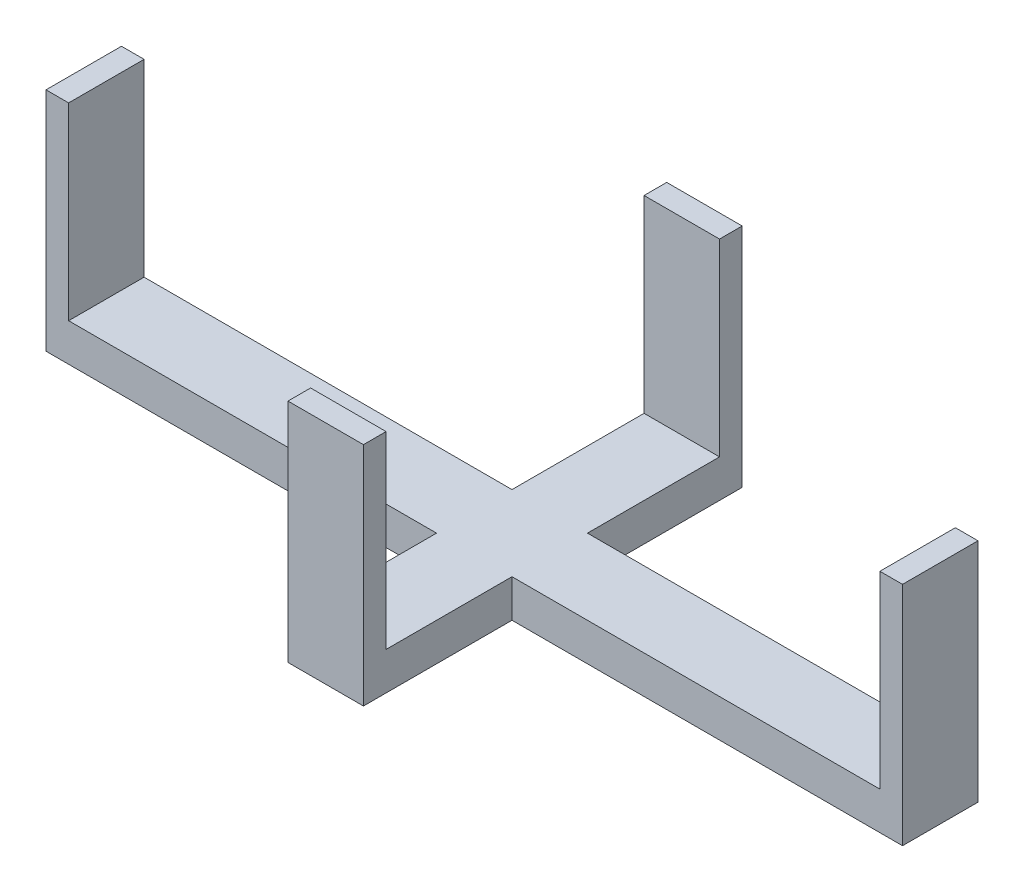
ISO-10303-21;
HEADER;
FILE_DESCRIPTION(('STEP AP214'),'2;1');
FILE_NAME('part.step','',(''),(''),'','','');
FILE_SCHEMA(('AUTOMOTIVE_DESIGN { 1 0 10303 214 1 1 1 1 }'));
ENDSEC;
DATA;
#1=APPLICATION_CONTEXT('core data for automotive mechanical design processes');
#2=APPLICATION_PROTOCOL_DEFINITION('international standard','automotive_design',2000,#1);
#3=PRODUCT_CONTEXT('',#1,'mechanical');
#4=PRODUCT('Part','Part','',(#3));
#5=PRODUCT_RELATED_PRODUCT_CATEGORY('part','',(#4));
#6=PRODUCT_DEFINITION_FORMATION('','',#4);
#7=PRODUCT_DEFINITION_CONTEXT('part definition',#1,'design');
#8=PRODUCT_DEFINITION('design','',#6,#7);
#9=PRODUCT_DEFINITION_SHAPE('','',#8);
#10=(LENGTH_UNIT() NAMED_UNIT(*) SI_UNIT(.MILLI.,.METRE.));
#11=(NAMED_UNIT(*) PLANE_ANGLE_UNIT() SI_UNIT($,.RADIAN.));
#12=(NAMED_UNIT(*) SI_UNIT($,.STERADIAN.) SOLID_ANGLE_UNIT());
#13=UNCERTAINTY_MEASURE_WITH_UNIT(LENGTH_MEASURE(1.E-05),#10,'distance_accuracy_value','');
#14=(GEOMETRIC_REPRESENTATION_CONTEXT(3) GLOBAL_UNCERTAINTY_ASSIGNED_CONTEXT((#13)) GLOBAL_UNIT_ASSIGNED_CONTEXT((#10,
#11,#12)) REPRESENTATION_CONTEXT('',''));
#15=CARTESIAN_POINT('',(0.,0.,0.));
#16=DIRECTION('',(0.,0.,1.));
#17=DIRECTION('',(1.,0.,0.));
#18=AXIS2_PLACEMENT_3D('',#15,#16,#17);
#19=CARTESIAN_POINT('',(0.,30.,-27.5));
#20=DIRECTION('',(0.,0.,1.));
#21=DIRECTION('',(1.,0.,0.));
#22=AXIS2_PLACEMENT_3D('',#19,#20,#21);
#23=PLANE('',#22);
#24=DIRECTION('',(0.,-1.,0.));
#25=VECTOR('',#24,1.);
#26=CARTESIAN_POINT('',(48.75,30.,-27.5));
#27=LINE('',#26,#25);
#28=CARTESIAN_POINT('',(48.75,30.,-27.5));
#29=VERTEX_POINT('',#28);
#30=CARTESIAN_POINT('',(48.75,5.,-27.5));
#31=VERTEX_POINT('',#30);
#32=EDGE_CURVE('E323',#29,#31,#27,.T.);
#33=ORIENTED_EDGE('',*,*,#32,.T.);
#34=DIRECTION('',(1.,0.,0.));
#35=VECTOR('',#34,1.);
#36=CARTESIAN_POINT('',(0.,5.,-27.5));
#37=LINE('',#36,#35);
#38=CARTESIAN_POINT('',(58.75,5.,-27.5));
#39=VERTEX_POINT('',#38);
#40=EDGE_CURVE('E229',#31,#39,#37,.T.);
#41=ORIENTED_EDGE('',*,*,#40,.T.);
#42=DIRECTION('',(0.,-1.,0.));
#43=VECTOR('',#42,1.);
#44=CARTESIAN_POINT('',(58.75,30.,-27.5));
#45=LINE('',#44,#43);
#46=CARTESIAN_POINT('',(58.75,30.,-27.5));
#47=VERTEX_POINT('',#46);
#48=EDGE_CURVE('E57',#47,#39,#45,.T.);
#49=ORIENTED_EDGE('',*,*,#48,.F.);
#50=DIRECTION('',(-1.,0.,0.));
#51=VECTOR('',#50,1.);
#52=CARTESIAN_POINT('',(0.,30.,-27.5));
#53=LINE('',#52,#51);
#54=EDGE_CURVE('E320',#47,#29,#53,.T.);
#55=ORIENTED_EDGE('',*,*,#54,.T.);
#56=EDGE_LOOP('',(#33,#41,#49,#55));
#57=FACE_BOUND('',#56,.T.);
#58=ADVANCED_FACE('F35',(#57),#23,.T.);
#59=CARTESIAN_POINT('',(58.75,30.,0.));
#60=DIRECTION('',(-1.,0.,0.));
#61=DIRECTION('',(0.,0.,1.));
#62=AXIS2_PLACEMENT_3D('',#59,#60,#61);
#63=PLANE('',#62);
#64=ORIENTED_EDGE('',*,*,#48,.T.);
#65=DIRECTION('',(0.,0.,-1.));
#66=VECTOR('',#65,1.);
#67=CARTESIAN_POINT('',(58.75,5.,0.));
#68=LINE('',#67,#66);
#69=CARTESIAN_POINT('',(58.75,5.,-10.));
#70=VERTEX_POINT('',#69);
#71=EDGE_CURVE('E50',#70,#39,#68,.T.);
#72=ORIENTED_EDGE('',*,*,#71,.F.);
#73=DIRECTION('',(0.,-1.,0.));
#74=VECTOR('',#73,1.);
#75=CARTESIAN_POINT('',(58.75,5.,-10.));
#76=LINE('',#75,#74);
#77=CARTESIAN_POINT('',(58.75,0.,-10.));
#78=VERTEX_POINT('',#77);
#79=EDGE_CURVE('E242',#70,#78,#76,.T.);
#80=ORIENTED_EDGE('',*,*,#79,.T.);
#81=DIRECTION('',(0.,0.,1.));
#82=VECTOR('',#81,1.);
#83=CARTESIAN_POINT('',(58.75,0.,-27.5));
#84=LINE('',#83,#82);
#85=CARTESIAN_POINT('',(58.75,0.,-30.5));
#86=VERTEX_POINT('',#85);
#87=EDGE_CURVE('E310',#86,#78,#84,.T.);
#88=ORIENTED_EDGE('',*,*,#87,.F.);
#89=DIRECTION('',(0.,-1.,0.));
#90=VECTOR('',#89,1.);
#91=CARTESIAN_POINT('',(58.75,30.,-30.5));
#92=LINE('',#91,#90);
#93=CARTESIAN_POINT('',(58.75,30.,-30.5));
#94=VERTEX_POINT('',#93);
#95=EDGE_CURVE('E11',#94,#86,#92,.T.);
#96=ORIENTED_EDGE('',*,*,#95,.F.);
#97=DIRECTION('',(0.,0.,-1.));
#98=VECTOR('',#97,1.);
#99=CARTESIAN_POINT('',(58.75,30.,0.));
#100=LINE('',#99,#98);
#101=EDGE_CURVE('E312',#47,#94,#100,.T.);
#102=ORIENTED_EDGE('',*,*,#101,.F.);
#103=EDGE_LOOP('',(#64,#72,#80,#88,#96,#102));
#104=FACE_BOUND('',#103,.T.);
#105=ADVANCED_FACE('F37',(#104),#63,.F.);
#106=CARTESIAN_POINT('',(0.,30.,-30.5));
#107=DIRECTION('',(0.,0.,1.));
#108=DIRECTION('',(1.,0.,0.));
#109=AXIS2_PLACEMENT_3D('',#106,#107,#108);
#110=PLANE('',#109);
#111=ORIENTED_EDGE('',*,*,#95,.T.);
#112=DIRECTION('',(1.,0.,0.));
#113=VECTOR('',#112,1.);
#114=CARTESIAN_POINT('',(58.75,0.,-30.5));
#115=LINE('',#114,#113);
#116=CARTESIAN_POINT('',(48.75,0.,-30.5));
#117=VERTEX_POINT('',#116);
#118=EDGE_CURVE('E307',#117,#86,#115,.T.);
#119=ORIENTED_EDGE('',*,*,#118,.F.);
#120=DIRECTION('',(0.,-1.,0.));
#121=VECTOR('',#120,1.);
#122=CARTESIAN_POINT('',(48.75,30.,-30.5));
#123=LINE('',#122,#121);
#124=CARTESIAN_POINT('',(48.75,30.,-30.5));
#125=VERTEX_POINT('',#124);
#126=EDGE_CURVE('E43',#125,#117,#123,.T.);
#127=ORIENTED_EDGE('',*,*,#126,.F.);
#128=DIRECTION('',(-1.,0.,0.));
#129=VECTOR('',#128,1.);
#130=CARTESIAN_POINT('',(0.,30.,-30.5));
#131=LINE('',#130,#129);
#132=EDGE_CURVE('E315',#94,#125,#131,.T.);
#133=ORIENTED_EDGE('',*,*,#132,.F.);
#134=EDGE_LOOP('',(#111,#119,#127,#133));
#135=FACE_BOUND('',#134,.T.);
#136=ADVANCED_FACE('F335',(#135),#110,.F.);
#137=CARTESIAN_POINT('',(48.75,30.,0.));
#138=DIRECTION('',(-1.,0.,0.));
#139=DIRECTION('',(0.,0.,1.));
#140=AXIS2_PLACEMENT_3D('',#137,#138,#139);
#141=PLANE('',#140);
#142=ORIENTED_EDGE('',*,*,#126,.T.);
#143=DIRECTION('',(0.,0.,-1.));
#144=VECTOR('',#143,1.);
#145=CARTESIAN_POINT('',(48.75,0.,-30.5));
#146=LINE('',#145,#144);
#147=CARTESIAN_POINT('',(48.75,0.,-10.));
#148=VERTEX_POINT('',#147);
#149=EDGE_CURVE('E304',#148,#117,#146,.T.);
#150=ORIENTED_EDGE('',*,*,#149,.F.);
#151=DIRECTION('',(0.,-1.,0.));
#152=VECTOR('',#151,1.);
#153=CARTESIAN_POINT('',(48.75,5.,-10.));
#154=LINE('',#153,#152);
#155=CARTESIAN_POINT('',(48.75,5.,-10.));
#156=VERTEX_POINT('',#155);
#157=EDGE_CURVE('E236',#156,#148,#154,.T.);
#158=ORIENTED_EDGE('',*,*,#157,.F.);
#159=DIRECTION('',(0.,0.,-1.));
#160=VECTOR('',#159,1.);
#161=CARTESIAN_POINT('',(48.75,5.,0.));
#162=LINE('',#161,#160);
#163=EDGE_CURVE('E231',#156,#31,#162,.T.);
#164=ORIENTED_EDGE('',*,*,#163,.T.);
#165=ORIENTED_EDGE('',*,*,#32,.F.);
#166=DIRECTION('',(0.,0.,-1.));
#167=VECTOR('',#166,1.);
#168=CARTESIAN_POINT('',(48.75,30.,0.));
#169=LINE('',#168,#167);
#170=EDGE_CURVE('E317',#29,#125,#169,.T.);
#171=ORIENTED_EDGE('',*,*,#170,.T.);
#172=EDGE_LOOP('',(#142,#150,#158,#164,#165,#171));
#173=FACE_BOUND('',#172,.T.);
#174=ADVANCED_FACE('F327',(#173),#141,.T.);
#175=CARTESIAN_POINT('',(0.,30.,0.));
#176=DIRECTION('',(0.,1.,0.));
#177=DIRECTION('',(0.,0.,1.));
#178=AXIS2_PLACEMENT_3D('',#175,#176,#177);
#179=PLANE('',#178);
#180=ORIENTED_EDGE('',*,*,#101,.T.);
#181=ORIENTED_EDGE('',*,*,#132,.T.);
#182=ORIENTED_EDGE('',*,*,#170,.F.);
#183=ORIENTED_EDGE('',*,*,#54,.F.);
#184=EDGE_LOOP('',(#180,#181,#182,#183));
#185=FACE_BOUND('',#184,.T.);
#186=ADVANCED_FACE('F384',(#185),#179,.T.);
#187=CARTESIAN_POINT('',(0.,0.,0.));
#188=DIRECTION('',(0.,1.,0.));
#189=DIRECTION('',(0.,0.,1.));
#190=AXIS2_PLACEMENT_3D('',#187,#188,#189);
#191=PLANE('',#190);
#192=ORIENTED_EDGE('',*,*,#87,.T.);
#193=DIRECTION('',(1.,0.,0.));
#194=VECTOR('',#193,1.);
#195=CARTESIAN_POINT('',(107.5,0.,-10.));
#196=LINE('',#195,#194);
#197=CARTESIAN_POINT('',(110.5,0.,-10.));
#198=VERTEX_POINT('',#197);
#199=EDGE_CURVE('E254',#78,#198,#196,.T.);
#200=ORIENTED_EDGE('',*,*,#199,.T.);
#201=DIRECTION('',(0.,0.,1.));
#202=VECTOR('',#201,1.);
#203=CARTESIAN_POINT('',(110.5,0.,-10.));
#204=LINE('',#203,#202);
#205=CARTESIAN_POINT('',(110.5,0.,0.));
#206=VERTEX_POINT('',#205);
#207=EDGE_CURVE('E257',#198,#206,#204,.T.);
#208=ORIENTED_EDGE('',*,*,#207,.T.);
#209=DIRECTION('',(-1.,0.,0.));
#210=VECTOR('',#209,1.);
#211=CARTESIAN_POINT('',(110.5,0.,0.));
#212=LINE('',#211,#210);
#213=CARTESIAN_POINT('',(58.75,0.,0.));
#214=VERTEX_POINT('',#213);
#215=EDGE_CURVE('E251',#206,#214,#212,.T.);
#216=ORIENTED_EDGE('',*,*,#215,.T.);
#217=DIRECTION('',(0.,0.,1.));
#218=VECTOR('',#217,1.);
#219=CARTESIAN_POINT('',(58.75,0.,19.6853921095083));
#220=LINE('',#219,#218);
#221=CARTESIAN_POINT('',(58.75,0.,19.6853921095083));
#222=VERTEX_POINT('',#221);
#223=EDGE_CURVE('E278',#214,#222,#220,.T.);
#224=ORIENTED_EDGE('',*,*,#223,.T.);
#225=DIRECTION('',(-1.,0.,0.));
#226=VECTOR('',#225,1.);
#227=CARTESIAN_POINT('',(48.75,0.,19.6853921095083));
#228=LINE('',#227,#226);
#229=CARTESIAN_POINT('',(48.75,0.,19.6853921095083));
#230=VERTEX_POINT('',#229);
#231=EDGE_CURVE('E281',#222,#230,#228,.T.);
#232=ORIENTED_EDGE('',*,*,#231,.T.);
#233=DIRECTION('',(0.,0.,-1.));
#234=VECTOR('',#233,1.);
#235=CARTESIAN_POINT('',(48.75,0.,16.6853921095083));
#236=LINE('',#235,#234);
#237=CARTESIAN_POINT('',(48.75,0.,0.));
#238=VERTEX_POINT('',#237);
#239=EDGE_CURVE('E284',#230,#238,#236,.T.);
#240=ORIENTED_EDGE('',*,*,#239,.T.);
#241=DIRECTION('',(1.,0.,0.));
#242=VECTOR('',#241,1.);
#243=CARTESIAN_POINT('',(0.,0.,0.));
#244=LINE('',#243,#242);
#245=CARTESIAN_POINT('',(-3.,0.,0.));
#246=VERTEX_POINT('',#245);
#247=EDGE_CURVE('E208',#246,#238,#244,.T.);
#248=ORIENTED_EDGE('',*,*,#247,.F.);
#249=DIRECTION('',(0.,0.,-1.));
#250=VECTOR('',#249,1.);
#251=CARTESIAN_POINT('',(-3.,0.,-10.));
#252=LINE('',#251,#250);
#253=CARTESIAN_POINT('',(-3.,0.,-10.));
#254=VERTEX_POINT('',#253);
#255=EDGE_CURVE('E197',#246,#254,#252,.T.);
#256=ORIENTED_EDGE('',*,*,#255,.T.);
#257=DIRECTION('',(-1.,0.,0.));
#258=VECTOR('',#257,1.);
#259=CARTESIAN_POINT('',(0.,0.,-10.));
#260=LINE('',#259,#258);
#261=EDGE_CURVE('E212',#148,#254,#260,.T.);
#262=ORIENTED_EDGE('',*,*,#261,.F.);
#263=ORIENTED_EDGE('',*,*,#149,.T.);
#264=ORIENTED_EDGE('',*,*,#118,.T.);
#265=EDGE_LOOP('',(#192,#200,#208,#216,#224,#232,#240,#248,#256,#262,#263,#264));
#266=FACE_BOUND('',#265,.T.);
#267=ADVANCED_FACE('F333',(#266),#191,.F.);
#268=CARTESIAN_POINT('',(48.75,30.,16.6853921095083));
#269=DIRECTION('',(0.,0.,1.));
#270=DIRECTION('',(1.,0.,0.));
#271=AXIS2_PLACEMENT_3D('',#268,#269,#270);
#272=PLANE('',#271);
#273=DIRECTION('',(1.,0.,0.));
#274=VECTOR('',#273,1.);
#275=CARTESIAN_POINT('',(0.,5.,16.6853921095083));
#276=LINE('',#275,#274);
#277=CARTESIAN_POINT('',(48.75,5.,16.6853921095083));
#278=VERTEX_POINT('',#277);
#279=CARTESIAN_POINT('',(58.75,5.,16.6853921095083));
#280=VERTEX_POINT('',#279);
#281=EDGE_CURVE('E215',#278,#280,#276,.T.);
#282=ORIENTED_EDGE('',*,*,#281,.F.);
#283=DIRECTION('',(0.,-1.,0.));
#284=VECTOR('',#283,1.);
#285=CARTESIAN_POINT('',(48.75,30.,16.6853921095083));
#286=LINE('',#285,#284);
#287=CARTESIAN_POINT('',(48.75,30.,16.6853921095083));
#288=VERTEX_POINT('',#287);
#289=EDGE_CURVE('E295',#288,#278,#286,.T.);
#290=ORIENTED_EDGE('',*,*,#289,.F.);
#291=DIRECTION('',(-1.,0.,0.));
#292=VECTOR('',#291,1.);
#293=CARTESIAN_POINT('',(48.75,30.,16.6853921095083));
#294=LINE('',#293,#292);
#295=CARTESIAN_POINT('',(58.75,30.,16.6853921095083));
#296=VERTEX_POINT('',#295);
#297=EDGE_CURVE('E293',#296,#288,#294,.T.);
#298=ORIENTED_EDGE('',*,*,#297,.F.);
#299=DIRECTION('',(0.,-1.,0.));
#300=VECTOR('',#299,1.);
#301=CARTESIAN_POINT('',(58.75,30.,16.6853921095083));
#302=LINE('',#301,#300);
#303=EDGE_CURVE('E298',#296,#280,#302,.T.);
#304=ORIENTED_EDGE('',*,*,#303,.T.);
#305=EDGE_LOOP('',(#282,#290,#298,#304));
#306=FACE_BOUND('',#305,.T.);
#307=ADVANCED_FACE('F391',(#306),#272,.F.);
#308=CARTESIAN_POINT('',(48.75,30.,19.6853921095083));
#309=DIRECTION('',(1.,0.,0.));
#310=DIRECTION('',(0.,0.,-1.));
#311=AXIS2_PLACEMENT_3D('',#308,#309,#310);
#312=PLANE('',#311);
#313=ORIENTED_EDGE('',*,*,#289,.T.);
#314=DIRECTION('',(0.,0.,1.));
#315=VECTOR('',#314,1.);
#316=CARTESIAN_POINT('',(48.75,5.,0.));
#317=LINE('',#316,#315);
#318=CARTESIAN_POINT('',(48.75,5.,0.));
#319=VERTEX_POINT('',#318);
#320=EDGE_CURVE('E211',#319,#278,#317,.T.);
#321=ORIENTED_EDGE('',*,*,#320,.F.);
#322=DIRECTION('',(0.,-1.,0.));
#323=VECTOR('',#322,1.);
#324=CARTESIAN_POINT('',(48.75,5.,0.));
#325=LINE('',#324,#323);
#326=EDGE_CURVE('E248',#319,#238,#325,.T.);
#327=ORIENTED_EDGE('',*,*,#326,.T.);
#328=ORIENTED_EDGE('',*,*,#239,.F.);
#329=DIRECTION('',(0.,-1.,0.));
#330=VECTOR('',#329,1.);
#331=CARTESIAN_POINT('',(48.75,30.,19.6853921095083));
#332=LINE('',#331,#330);
#333=CARTESIAN_POINT('',(48.75,30.,19.6853921095083));
#334=VERTEX_POINT('',#333);
#335=EDGE_CURVE('E302',#334,#230,#332,.T.);
#336=ORIENTED_EDGE('',*,*,#335,.F.);
#337=DIRECTION('',(0.,0.,1.));
#338=VECTOR('',#337,1.);
#339=CARTESIAN_POINT('',(48.75,30.,19.6853921095083));
#340=LINE('',#339,#338);
#341=EDGE_CURVE('E286',#288,#334,#340,.T.);
#342=ORIENTED_EDGE('',*,*,#341,.F.);
#343=EDGE_LOOP('',(#313,#321,#327,#328,#336,#342));
#344=FACE_BOUND('',#343,.T.);
#345=ADVANCED_FACE('F368',(#344),#312,.F.);
#346=CARTESIAN_POINT('',(58.75,30.,19.6853921095083));
#347=DIRECTION('',(0.,0.,-1.));
#348=DIRECTION('',(-1.,0.,0.));
#349=AXIS2_PLACEMENT_3D('',#346,#347,#348);
#350=PLANE('',#349);
#351=ORIENTED_EDGE('',*,*,#335,.T.);
#352=ORIENTED_EDGE('',*,*,#231,.F.);
#353=DIRECTION('',(0.,-1.,0.));
#354=VECTOR('',#353,1.);
#355=CARTESIAN_POINT('',(58.75,30.,19.6853921095083));
#356=LINE('',#355,#354);
#357=CARTESIAN_POINT('',(58.75,30.,19.6853921095083));
#358=VERTEX_POINT('',#357);
#359=EDGE_CURVE('E300',#358,#222,#356,.T.);
#360=ORIENTED_EDGE('',*,*,#359,.F.);
#361=DIRECTION('',(1.,0.,0.));
#362=VECTOR('',#361,1.);
#363=CARTESIAN_POINT('',(58.75,30.,19.6853921095083));
#364=LINE('',#363,#362);
#365=EDGE_CURVE('E289',#334,#358,#364,.T.);
#366=ORIENTED_EDGE('',*,*,#365,.F.);
#367=EDGE_LOOP('',(#351,#352,#360,#366));
#368=FACE_BOUND('',#367,.T.);
#369=ADVANCED_FACE('F436',(#368),#350,.F.);
#370=CARTESIAN_POINT('',(58.75,30.,16.6853921095083));
#371=DIRECTION('',(-1.,0.,0.));
#372=DIRECTION('',(0.,0.,1.));
#373=AXIS2_PLACEMENT_3D('',#370,#371,#372);
#374=PLANE('',#373);
#375=ORIENTED_EDGE('',*,*,#359,.T.);
#376=ORIENTED_EDGE('',*,*,#223,.F.);
#377=DIRECTION('',(0.,-1.,0.));
#378=VECTOR('',#377,1.);
#379=CARTESIAN_POINT('',(58.75,5.,0.));
#380=LINE('',#379,#378);
#381=CARTESIAN_POINT('',(58.75,5.,0.));
#382=VERTEX_POINT('',#381);
#383=EDGE_CURVE('E245',#382,#214,#380,.T.);
#384=ORIENTED_EDGE('',*,*,#383,.F.);
#385=DIRECTION('',(0.,0.,-1.));
#386=VECTOR('',#385,1.);
#387=CARTESIAN_POINT('',(58.75,5.,0.));
#388=LINE('',#387,#386);
#389=EDGE_CURVE('E218',#280,#382,#388,.T.);
#390=ORIENTED_EDGE('',*,*,#389,.F.);
#391=ORIENTED_EDGE('',*,*,#303,.F.);
#392=DIRECTION('',(0.,0.,-1.));
#393=VECTOR('',#392,1.);
#394=CARTESIAN_POINT('',(58.75,30.,16.6853921095083));
#395=LINE('',#394,#393);
#396=EDGE_CURVE('E291',#358,#296,#395,.T.);
#397=ORIENTED_EDGE('',*,*,#396,.F.);
#398=EDGE_LOOP('',(#375,#376,#384,#390,#391,#397));
#399=FACE_BOUND('',#398,.T.);
#400=ADVANCED_FACE('F359',(#399),#374,.F.);
#401=CARTESIAN_POINT('',(0.,30.,0.));
#402=DIRECTION('',(0.,-1.,0.));
#403=DIRECTION('',(0.,0.,-1.));
#404=AXIS2_PLACEMENT_3D('',#401,#402,#403);
#405=PLANE('',#404);
#406=ORIENTED_EDGE('',*,*,#341,.T.);
#407=ORIENTED_EDGE('',*,*,#365,.T.);
#408=ORIENTED_EDGE('',*,*,#396,.T.);
#409=ORIENTED_EDGE('',*,*,#297,.T.);
#410=EDGE_LOOP('',(#406,#407,#408,#409));
#411=FACE_BOUND('',#410,.T.);
#412=ADVANCED_FACE('F456',(#411),#405,.F.);
#413=CARTESIAN_POINT('',(107.5,30.,0.));
#414=DIRECTION('',(1.,0.,0.));
#415=DIRECTION('',(0.,0.,-1.));
#416=AXIS2_PLACEMENT_3D('',#413,#414,#415);
#417=PLANE('',#416);
#418=DIRECTION('',(0.,0.,-1.));
#419=VECTOR('',#418,1.);
#420=CARTESIAN_POINT('',(107.5,5.,0.));
#421=LINE('',#420,#419);
#422=CARTESIAN_POINT('',(107.5,5.,0.));
#423=VERTEX_POINT('',#422);
#424=CARTESIAN_POINT('',(107.5,5.,-10.));
#425=VERTEX_POINT('',#424);
#426=EDGE_CURVE('E223',#423,#425,#421,.T.);
#427=ORIENTED_EDGE('',*,*,#426,.F.);
#428=DIRECTION('',(0.,-1.,0.));
#429=VECTOR('',#428,1.);
#430=CARTESIAN_POINT('',(107.5,30.,0.));
#431=LINE('',#430,#429);
#432=CARTESIAN_POINT('',(107.5,30.,0.));
#433=VERTEX_POINT('',#432);
#434=EDGE_CURVE('E275',#433,#423,#431,.T.);
#435=ORIENTED_EDGE('',*,*,#434,.F.);
#436=DIRECTION('',(0.,0.,1.));
#437=VECTOR('',#436,1.);
#438=CARTESIAN_POINT('',(107.5,30.,0.));
#439=LINE('',#438,#437);
#440=CARTESIAN_POINT('',(107.5,30.,-10.));
#441=VERTEX_POINT('',#440);
#442=EDGE_CURVE('E260',#441,#433,#439,.T.);
#443=ORIENTED_EDGE('',*,*,#442,.F.);
#444=DIRECTION('',(0.,-1.,0.));
#445=VECTOR('',#444,1.);
#446=CARTESIAN_POINT('',(107.5,30.,-10.));
#447=LINE('',#446,#445);
#448=EDGE_CURVE('E269',#441,#425,#447,.T.);
#449=ORIENTED_EDGE('',*,*,#448,.T.);
#450=EDGE_LOOP('',(#427,#435,#443,#449));
#451=FACE_BOUND('',#450,.T.);
#452=ADVANCED_FACE('F466',(#451),#417,.F.);
#453=CARTESIAN_POINT('',(110.5,30.,0.));
#454=DIRECTION('',(0.,0.,-1.));
#455=DIRECTION('',(-1.,0.,0.));
#456=AXIS2_PLACEMENT_3D('',#453,#454,#455);
#457=PLANE('',#456);
#458=ORIENTED_EDGE('',*,*,#434,.T.);
#459=DIRECTION('',(1.,0.,0.));
#460=VECTOR('',#459,1.);
#461=CARTESIAN_POINT('',(0.,5.,0.));
#462=LINE('',#461,#460);
#463=EDGE_CURVE('E220',#382,#423,#462,.T.);
#464=ORIENTED_EDGE('',*,*,#463,.F.);
#465=ORIENTED_EDGE('',*,*,#383,.T.);
#466=ORIENTED_EDGE('',*,*,#215,.F.);
#467=DIRECTION('',(0.,-1.,0.));
#468=VECTOR('',#467,1.);
#469=CARTESIAN_POINT('',(110.5,30.,0.));
#470=LINE('',#469,#468);
#471=CARTESIAN_POINT('',(110.5,30.,0.));
#472=VERTEX_POINT('',#471);
#473=EDGE_CURVE('E273',#472,#206,#470,.T.);
#474=ORIENTED_EDGE('',*,*,#473,.F.);
#475=DIRECTION('',(1.,0.,0.));
#476=VECTOR('',#475,1.);
#477=CARTESIAN_POINT('',(110.5,30.,0.));
#478=LINE('',#477,#476);
#479=EDGE_CURVE('E263',#433,#472,#478,.T.);
#480=ORIENTED_EDGE('',*,*,#479,.F.);
#481=EDGE_LOOP('',(#458,#464,#465,#466,#474,#480));
#482=FACE_BOUND('',#481,.T.);
#483=ADVANCED_FACE('F354',(#482),#457,.F.);
#484=CARTESIAN_POINT('',(110.5,30.,-10.));
#485=DIRECTION('',(-1.,0.,0.));
#486=DIRECTION('',(0.,0.,1.));
#487=AXIS2_PLACEMENT_3D('',#484,#485,#486);
#488=PLANE('',#487);
#489=ORIENTED_EDGE('',*,*,#473,.T.);
#490=ORIENTED_EDGE('',*,*,#207,.F.);
#491=DIRECTION('',(0.,-1.,0.));
#492=VECTOR('',#491,1.);
#493=CARTESIAN_POINT('',(110.5,30.,-10.));
#494=LINE('',#493,#492);
#495=CARTESIAN_POINT('',(110.5,30.,-10.));
#496=VERTEX_POINT('',#495);
#497=EDGE_CURVE('E271',#496,#198,#494,.T.);
#498=ORIENTED_EDGE('',*,*,#497,.F.);
#499=DIRECTION('',(0.,0.,-1.));
#500=VECTOR('',#499,1.);
#501=CARTESIAN_POINT('',(110.5,30.,-10.));
#502=LINE('',#501,#500);
#503=EDGE_CURVE('E265',#472,#496,#502,.T.);
#504=ORIENTED_EDGE('',*,*,#503,.F.);
#505=EDGE_LOOP('',(#489,#490,#498,#504));
#506=FACE_BOUND('',#505,.T.);
#507=ADVANCED_FACE('F350',(#506),#488,.F.);
#508=CARTESIAN_POINT('',(107.5,30.,-10.));
#509=DIRECTION('',(0.,0.,1.));
#510=DIRECTION('',(1.,0.,0.));
#511=AXIS2_PLACEMENT_3D('',#508,#509,#510);
#512=PLANE('',#511);
#513=ORIENTED_EDGE('',*,*,#497,.T.);
#514=ORIENTED_EDGE('',*,*,#199,.F.);
#515=ORIENTED_EDGE('',*,*,#79,.F.);
#516=DIRECTION('',(-1.,0.,0.));
#517=VECTOR('',#516,1.);
#518=CARTESIAN_POINT('',(0.,5.,-10.));
#519=LINE('',#518,#517);
#520=EDGE_CURVE('E226',#425,#70,#519,.T.);
#521=ORIENTED_EDGE('',*,*,#520,.F.);
#522=ORIENTED_EDGE('',*,*,#448,.F.);
#523=DIRECTION('',(-1.,0.,0.));
#524=VECTOR('',#523,1.);
#525=CARTESIAN_POINT('',(107.5,30.,-10.));
#526=LINE('',#525,#524);
#527=EDGE_CURVE('E267',#496,#441,#526,.T.);
#528=ORIENTED_EDGE('',*,*,#527,.F.);
#529=EDGE_LOOP('',(#513,#514,#515,#521,#522,#528));
#530=FACE_BOUND('',#529,.T.);
#531=ADVANCED_FACE('F343',(#530),#512,.F.);
#532=CARTESIAN_POINT('',(0.,30.,0.));
#533=DIRECTION('',(0.,-1.,0.));
#534=DIRECTION('',(0.,0.,-1.));
#535=AXIS2_PLACEMENT_3D('',#532,#533,#534);
#536=PLANE('',#535);
#537=ORIENTED_EDGE('',*,*,#442,.T.);
#538=ORIENTED_EDGE('',*,*,#479,.T.);
#539=ORIENTED_EDGE('',*,*,#503,.T.);
#540=ORIENTED_EDGE('',*,*,#527,.T.);
#541=EDGE_LOOP('',(#537,#538,#539,#540));
#542=FACE_BOUND('',#541,.T.);
#543=ADVANCED_FACE('F506',(#542),#536,.F.);
#544=CARTESIAN_POINT('',(0.,5.,0.));
#545=DIRECTION('',(0.,0.,-1.));
#546=DIRECTION('',(-1.,0.,0.));
#547=AXIS2_PLACEMENT_3D('',#544,#545,#546);
#548=PLANE('',#547);
#549=ORIENTED_EDGE('',*,*,#247,.T.);
#550=ORIENTED_EDGE('',*,*,#326,.F.);
#551=DIRECTION('',(1.,0.,0.));
#552=VECTOR('',#551,1.);
#553=CARTESIAN_POINT('',(0.,5.,0.));
#554=LINE('',#553,#552);
#555=CARTESIAN_POINT('',(0.,5.,0.));
#556=VERTEX_POINT('',#555);
#557=EDGE_CURVE('E209',#556,#319,#554,.T.);
#558=ORIENTED_EDGE('',*,*,#557,.F.);
#559=DIRECTION('',(0.,-1.,0.));
#560=VECTOR('',#559,1.);
#561=CARTESIAN_POINT('',(0.,30.,0.));
#562=LINE('',#561,#560);
#563=CARTESIAN_POINT('',(0.,30.,0.));
#564=VERTEX_POINT('',#563);
#565=EDGE_CURVE('E198',#564,#556,#562,.T.);
#566=ORIENTED_EDGE('',*,*,#565,.F.);
#567=DIRECTION('',(1.,0.,0.));
#568=VECTOR('',#567,1.);
#569=CARTESIAN_POINT('',(-3.,30.,0.));
#570=LINE('',#569,#568);
#571=CARTESIAN_POINT('',(-3.,30.,0.));
#572=VERTEX_POINT('',#571);
#573=EDGE_CURVE('E190',#572,#564,#570,.T.);
#574=ORIENTED_EDGE('',*,*,#573,.F.);
#575=DIRECTION('',(0.,1.,0.));
#576=VECTOR('',#575,1.);
#577=CARTESIAN_POINT('',(-3.,0.,0.));
#578=LINE('',#577,#576);
#579=EDGE_CURVE('E206',#246,#572,#578,.T.);
#580=ORIENTED_EDGE('',*,*,#579,.F.);
#581=EDGE_LOOP('',(#549,#550,#558,#566,#574,#580));
#582=FACE_BOUND('',#581,.T.);
#583=ADVANCED_FACE('F375',(#582),#548,.F.);
#584=CARTESIAN_POINT('',(0.,5.,-10.));
#585=DIRECTION('',(0.,0.,1.));
#586=DIRECTION('',(1.,0.,0.));
#587=AXIS2_PLACEMENT_3D('',#584,#585,#586);
#588=PLANE('',#587);
#589=ORIENTED_EDGE('',*,*,#261,.T.);
#590=DIRECTION('',(0.,1.,0.));
#591=VECTOR('',#590,1.);
#592=CARTESIAN_POINT('',(-3.,0.,-10.));
#593=LINE('',#592,#591);
#594=CARTESIAN_POINT('',(-3.,30.,-10.));
#595=VERTEX_POINT('',#594);
#596=EDGE_CURVE('E180',#254,#595,#593,.T.);
#597=ORIENTED_EDGE('',*,*,#596,.T.);
#598=DIRECTION('',(-1.,0.,0.));
#599=VECTOR('',#598,1.);
#600=CARTESIAN_POINT('',(0.,30.,-10.));
#601=LINE('',#600,#599);
#602=CARTESIAN_POINT('',(0.,30.,-10.));
#603=VERTEX_POINT('',#602);
#604=EDGE_CURVE('E172',#603,#595,#601,.T.);
#605=ORIENTED_EDGE('',*,*,#604,.F.);
#606=DIRECTION('',(0.,-1.,0.));
#607=VECTOR('',#606,1.);
#608=CARTESIAN_POINT('',(0.,30.,-10.));
#609=LINE('',#608,#607);
#610=CARTESIAN_POINT('',(0.,5.,-10.));
#611=VERTEX_POINT('',#610);
#612=EDGE_CURVE('E177',#603,#611,#609,.T.);
#613=ORIENTED_EDGE('',*,*,#612,.T.);
#614=DIRECTION('',(-1.,0.,0.));
#615=VECTOR('',#614,1.);
#616=CARTESIAN_POINT('',(0.,5.,-10.));
#617=LINE('',#616,#615);
#618=EDGE_CURVE('E234',#156,#611,#617,.T.);
#619=ORIENTED_EDGE('',*,*,#618,.F.);
#620=ORIENTED_EDGE('',*,*,#157,.T.);
#621=EDGE_LOOP('',(#589,#597,#605,#613,#619,#620));
#622=FACE_BOUND('',#621,.T.);
#623=ADVANCED_FACE('F174',(#622),#588,.F.);
#624=CARTESIAN_POINT('',(0.,5.,0.));
#625=DIRECTION('',(0.,1.,0.));
#626=DIRECTION('',(0.,0.,1.));
#627=AXIS2_PLACEMENT_3D('',#624,#625,#626);
#628=PLANE('',#627);
#629=DIRECTION('',(0.,0.,-1.));
#630=VECTOR('',#629,1.);
#631=CARTESIAN_POINT('',(0.,5.,-10.));
#632=LINE('',#631,#630);
#633=EDGE_CURVE('E194',#556,#611,#632,.T.);
#634=ORIENTED_EDGE('',*,*,#633,.F.);
#635=ORIENTED_EDGE('',*,*,#557,.T.);
#636=ORIENTED_EDGE('',*,*,#320,.T.);
#637=ORIENTED_EDGE('',*,*,#281,.T.);
#638=ORIENTED_EDGE('',*,*,#389,.T.);
#639=ORIENTED_EDGE('',*,*,#463,.T.);
#640=ORIENTED_EDGE('',*,*,#426,.T.);
#641=ORIENTED_EDGE('',*,*,#520,.T.);
#642=ORIENTED_EDGE('',*,*,#71,.T.);
#643=ORIENTED_EDGE('',*,*,#40,.F.);
#644=ORIENTED_EDGE('',*,*,#163,.F.);
#645=ORIENTED_EDGE('',*,*,#618,.T.);
#646=EDGE_LOOP('',(#634,#635,#636,#637,#638,#639,#640,#641,#642,#643,#644,#645));
#647=FACE_BOUND('',#646,.T.);
#648=ADVANCED_FACE('F381',(#647),#628,.T.);
#649=CARTESIAN_POINT('',(-3.,0.,-10.));
#650=DIRECTION('',(1.,0.,0.));
#651=DIRECTION('',(0.,0.,-1.));
#652=AXIS2_PLACEMENT_3D('',#649,#650,#651);
#653=PLANE('',#652);
#654=ORIENTED_EDGE('',*,*,#579,.T.);
#655=DIRECTION('',(0.,0.,1.));
#656=VECTOR('',#655,1.);
#657=CARTESIAN_POINT('',(-3.,30.,-10.));
#658=LINE('',#657,#656);
#659=EDGE_CURVE('E184',#595,#572,#658,.T.);
#660=ORIENTED_EDGE('',*,*,#659,.F.);
#661=ORIENTED_EDGE('',*,*,#596,.F.);
#662=ORIENTED_EDGE('',*,*,#255,.F.);
#663=EDGE_LOOP('',(#654,#660,#661,#662));
#664=FACE_BOUND('',#663,.T.);
#665=ADVANCED_FACE('F378',(#664),#653,.F.);
#666=CARTESIAN_POINT('',(0.,30.,-10.));
#667=DIRECTION('',(-1.,0.,0.));
#668=DIRECTION('',(0.,0.,1.));
#669=AXIS2_PLACEMENT_3D('',#666,#667,#668);
#670=PLANE('',#669);
#671=ORIENTED_EDGE('',*,*,#633,.T.);
#672=ORIENTED_EDGE('',*,*,#612,.F.);
#673=DIRECTION('',(0.,0.,-1.));
#674=VECTOR('',#673,1.);
#675=CARTESIAN_POINT('',(0.,30.,-10.));
#676=LINE('',#675,#674);
#677=EDGE_CURVE('E185',#564,#603,#676,.T.);
#678=ORIENTED_EDGE('',*,*,#677,.F.);
#679=ORIENTED_EDGE('',*,*,#565,.T.);
#680=EDGE_LOOP('',(#671,#672,#678,#679));
#681=FACE_BOUND('',#680,.T.);
#682=ADVANCED_FACE('F196',(#681),#670,.F.);
#683=CARTESIAN_POINT('',(0.,30.,0.));
#684=DIRECTION('',(0.,1.,0.));
#685=DIRECTION('',(0.,0.,1.));
#686=AXIS2_PLACEMENT_3D('',#683,#684,#685);
#687=PLANE('',#686);
#688=ORIENTED_EDGE('',*,*,#677,.T.);
#689=ORIENTED_EDGE('',*,*,#604,.T.);
#690=ORIENTED_EDGE('',*,*,#659,.T.);
#691=ORIENTED_EDGE('',*,*,#573,.T.);
#692=EDGE_LOOP('',(#688,#689,#690,#691));
#693=FACE_BOUND('',#692,.T.);
#694=ADVANCED_FACE('F188',(#693),#687,.T.);
#695=CLOSED_SHELL('',(#58,#105,#136,#174,#186,#267,#307,#345,#369,#400,#412,#452,#483,#507,#531,
#543,#583,#623,#648,#665,#682,#694));
#696=MANIFOLD_SOLID_BREP('B2',#695);
#697=ADVANCED_BREP_SHAPE_REPRESENTATION('',(#18,#696),#14);
#698=SHAPE_DEFINITION_REPRESENTATION(#9,#697);
ENDSEC;
END-ISO-10303-21;
